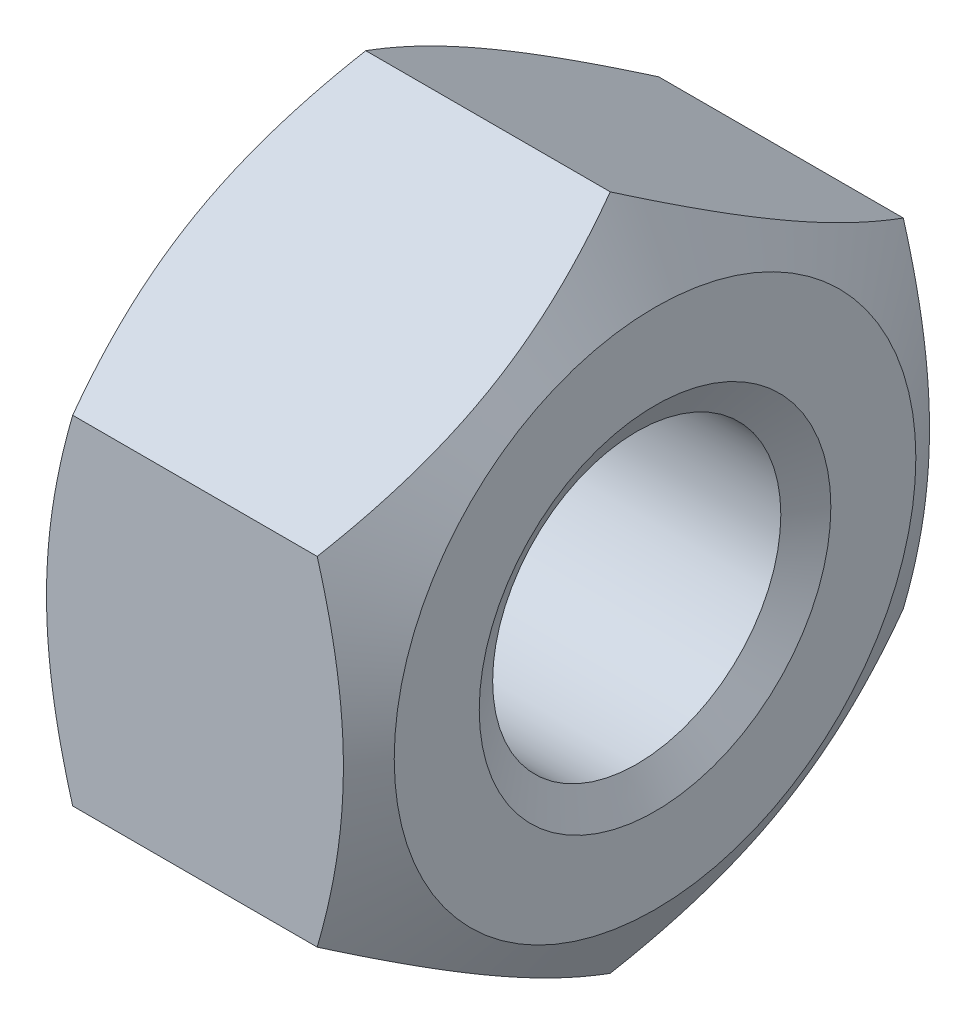
ISO-10303-21;
HEADER;
FILE_DESCRIPTION(('STEP AP214'),'2;1');
FILE_NAME('part.step','',(''),(''),'','','');
FILE_SCHEMA(('AUTOMOTIVE_DESIGN { 1 0 10303 214 1 1 1 1 }'));
ENDSEC;
DATA;
#1=APPLICATION_CONTEXT('core data for automotive mechanical design processes');
#2=APPLICATION_PROTOCOL_DEFINITION('international standard','automotive_design',2000,#1);
#3=PRODUCT_CONTEXT('',#1,'mechanical');
#4=PRODUCT('Part','Part','',(#3));
#5=PRODUCT_RELATED_PRODUCT_CATEGORY('part','',(#4));
#6=PRODUCT_DEFINITION_FORMATION('','',#4);
#7=PRODUCT_DEFINITION_CONTEXT('part definition',#1,'design');
#8=PRODUCT_DEFINITION('design','',#6,#7);
#9=PRODUCT_DEFINITION_SHAPE('','',#8);
#10=(LENGTH_UNIT() NAMED_UNIT(*) SI_UNIT(.MILLI.,.METRE.));
#11=(NAMED_UNIT(*) PLANE_ANGLE_UNIT() SI_UNIT($,.RADIAN.));
#12=(NAMED_UNIT(*) SI_UNIT($,.STERADIAN.) SOLID_ANGLE_UNIT());
#13=UNCERTAINTY_MEASURE_WITH_UNIT(LENGTH_MEASURE(1.E-05),#10,'distance_accuracy_value','');
#14=(GEOMETRIC_REPRESENTATION_CONTEXT(3) GLOBAL_UNCERTAINTY_ASSIGNED_CONTEXT((#13)) GLOBAL_UNIT_ASSIGNED_CONTEXT((#10,
#11,#12)) REPRESENTATION_CONTEXT('',''));
#15=CARTESIAN_POINT('',(0.,0.,0.));
#16=DIRECTION('',(0.,0.,1.));
#17=DIRECTION('',(1.,0.,0.));
#18=AXIS2_PLACEMENT_3D('',#15,#16,#17);
#19=CARTESIAN_POINT('',(0.,-2.88675134594812,-5.00000000000001));
#20=DIRECTION('',(0.,-0.866025403784438,-0.500000000000001));
#21=DIRECTION('',(0.,0.500000000000001,-0.866025403784438));
#22=AXIS2_PLACEMENT_3D('',#19,#20,#21);
#23=PLANE('',#22);
#24=CARTESIAN_POINT('',(4.93587536378223,-5.77350269327806,2.39334483201145E-09));
#25=CARTESIAN_POINT('',(5.00913197597871,-5.64664081463588,-0.219731216958545));
#26=CARTESIAN_POINT('',(5.07576140593012,-5.51869387902661,-0.441341810106548));
#27=CARTESIAN_POINT('',(5.19206166625867,-5.26058465871254,-0.888400093592512));
#28=CARTESIAN_POINT('',(5.2416913601334,-5.13041778931937,-1.11385572484365));
#29=CARTESIAN_POINT('',(5.31893103261935,-4.87167732667603,-1.56200735211579));
#30=CARTESIAN_POINT('',(5.34705553729756,-4.74314402016282,-1.7846335694615));
#31=CARTESIAN_POINT('',(5.37227209133285,-4.54989210804391,-2.11935569991128));
#32=CARTESIAN_POINT('',(5.37785063902691,-4.48543074218098,-2.23100606071116));
#33=CARTESIAN_POINT('',(5.38325622737467,-4.35644850107461,-2.4544098555815));
#34=CARTESIAN_POINT('',(5.38308344577573,-4.2919276277319,-2.5661632863598));
#35=CARTESIAN_POINT('',(5.37469562505833,-4.11517352295994,-2.87231037627117));
#36=CARTESIAN_POINT('',(5.36061837398472,-4.00299890567843,-3.06660251272234));
#37=CARTESIAN_POINT('',(5.31598589248879,-3.77939413491341,-3.45389733650215));
#38=CARTESIAN_POINT('',(5.28541541607219,-3.66796476695895,-3.64689866325456));
#39=CARTESIAN_POINT('',(5.20899966330075,-3.44390976232876,-4.03497331496413));
#40=CARTESIAN_POINT('',(5.16283069779537,-3.33131239240766,-4.2299976804661));
#41=CARTESIAN_POINT('',(5.05804651110353,-3.10779655128824,-4.61713847358142));
#42=CARTESIAN_POINT('',(4.99945589449335,-2.996875218813,-4.80925985707179));
#43=CARTESIAN_POINT('',(4.93587535496804,-2.8867513292997,-5.00000002883592));
#44=B_SPLINE_CURVE_WITH_KNOTS('',3,(#24,#25,#26,#27,#28,#29,#30,#31,#32,#33,#34,#35,#36,#37,#38,
#39,#40,#41,#42,#43),.UNSPECIFIED.,.F.,.F.,(4,2,2,2,2,2,2,2,2,4),(0.,0.792540029113323,
1.58698454301934,2.36176901597434,2.74878733628676,3.13579369563993,3.80946093893152,
4.48375197582745,5.172995557021,5.86088644397328),.UNSPECIFIED.);
#45=CARTESIAN_POINT('',(4.93587537137778,-5.77350268011129,2.044230373443E-08));
#46=VERTEX_POINT('',#45);
#47=CARTESIAN_POINT('',(4.93587535977402,-2.8867513376239,-5.00000001441797));
#48=VERTEX_POINT('',#47);
#49=EDGE_CURVE('E166',#46,#48,#44,.T.);
#50=ORIENTED_EDGE('',*,*,#49,.F.);
#51=DIRECTION('',(1.,0.,0.));
#52=VECTOR('',#51,1.);
#53=CARTESIAN_POINT('',(0.,-5.77350269189626,0.));
#54=LINE('',#53,#52);
#55=CARTESIAN_POINT('',(0.764124628573763,-5.77350268010766,-2.04239832176883E-08));
#56=VERTEX_POINT('',#55);
#57=EDGE_CURVE('E85',#56,#46,#54,.T.);
#58=ORIENTED_EDGE('',*,*,#57,.F.);
#59=CARTESIAN_POINT('',(0.764124644991023,-2.88675132929691,-5.00000002884075));
#60=CARTESIAN_POINT('',(0.690868032080811,-3.01361320817886,-4.78026880907357));
#61=CARTESIAN_POINT('',(0.624238601368808,-3.14156014402914,-4.55865821550813));
#62=CARTESIAN_POINT('',(0.507938339456662,-3.39966936484787,-4.11159993114807));
#63=CARTESIAN_POINT('',(0.45830864475962,-3.52983623450482,-3.88614429944005));
#64=CARTESIAN_POINT('',(0.381068970628507,-3.78857669770394,-3.43799267120525));
#65=CARTESIAN_POINT('',(0.352944465128796,-3.91711000450851,-3.2153664533549));
#66=CARTESIAN_POINT('',(0.327727909906793,-4.11036191709027,-2.88064432210345));
#67=CARTESIAN_POINT('',(0.322149361824922,-4.17482328311138,-2.76899396102957));
#68=CARTESIAN_POINT('',(0.316743772727072,-4.3038055245425,-2.54559016559677));
#69=CARTESIAN_POINT('',(0.316916553963722,-4.36832639805176,-2.43383673453));
#70=CARTESIAN_POINT('',(0.32530437360499,-4.54508050056753,-2.12768964852645));
#71=CARTESIAN_POINT('',(0.339381623574468,-4.65725511543776,-1.93339751625175));
#72=CARTESIAN_POINT('',(0.384014102235427,-4.88085988144037,-1.54610270072068));
#73=CARTESIAN_POINT('',(0.414584576919643,-4.99228924704381,-1.35310137804034));
#74=CARTESIAN_POINT('',(0.491000325714208,-5.21634424692963,-0.965026734548273));
#75=CARTESIAN_POINT('',(0.537169288955863,-5.32894161445994,-0.770002373187272));
#76=CARTESIAN_POINT('',(0.641953470819595,-5.55245745089045,-0.382861588193368));
#77=CARTESIAN_POINT('',(0.700544084867718,-5.66337878106724,-0.19074020868405));
#78=CARTESIAN_POINT('',(0.764124621761453,-5.77350266831268,-4.08479676459328E-08));
#79=B_SPLINE_CURVE_WITH_KNOTS('',3,(#59,#60,#61,#62,#63,#64,#65,#66,#67,#68,#69,#70,#71,#72,#73,
#74,#75,#76,#77,#78),.UNSPECIFIED.,.F.,.F.,(4,2,2,2,2,2,2,2,2,4),(0.,0.792540031091949,
1.58698454701942,2.36176902197982,2.7487873432902,3.13579370363966,3.80946093232886,
4.48375195456929,5.17299552035953,5.86088639203325),.UNSPECIFIED.);
#80=CARTESIAN_POINT('',(0.764124622879802,-2.88675130265502,-5.00000000000001));
#81=VERTEX_POINT('',#80);
#82=EDGE_CURVE('E167',#81,#56,#79,.T.);
#83=ORIENTED_EDGE('',*,*,#82,.F.);
#84=DIRECTION('',(1.,0.,0.));
#85=VECTOR('',#84,1.);
#86=CARTESIAN_POINT('',(0.,-2.88675134594811,-5.00000000000001));
#87=LINE('',#86,#85);
#88=EDGE_CURVE('E228',#48,#81,#87,.F.);
#89=ORIENTED_EDGE('',*,*,#88,.F.);
#90=EDGE_LOOP('',(#50,#58,#83,#89));
#91=FACE_BOUND('',#90,.T.);
#92=ADVANCED_FACE('F17',(#91),#23,.T.);
#93=CARTESIAN_POINT('',(0.,2.88675134594814,-5.));
#94=DIRECTION('',(0.,0.,-1.));
#95=DIRECTION('',(0.,1.,0.));
#96=AXIS2_PLACEMENT_3D('',#93,#94,#95);
#97=PLANE('',#96);
#98=CARTESIAN_POINT('',(4.93587538958568,-2.88675125932593,-5.00000000000001));
#99=CARTESIAN_POINT('',(5.00913199965968,-2.63302750355986,-5.00000000000001));
#100=CARTESIAN_POINT('',(5.0757614273577,-2.37713363386949,-5.00000000000001));
#101=CARTESIAN_POINT('',(5.19206168301077,-1.86091519644852,-5.00000000000001));
#102=CARTESIAN_POINT('',(5.24169137446643,-1.60058145934219,-5.00000000000001));
#103=CARTESIAN_POINT('',(5.31893104217468,-1.08310053732788,-5.00000000000001));
#104=CARTESIAN_POINT('',(5.34705554447796,-0.826033925886894,-5.00000000000001));
#105=CARTESIAN_POINT('',(5.37227209507019,-0.43953010417072,-5.00000000000001));
#106=CARTESIAN_POINT('',(5.37785064163685,-0.310607373303493,-5.00000000000001));
#107=CARTESIAN_POINT('',(5.3832562277966,-0.0526428928575287,-5.00000000000001));
#108=CARTESIAN_POINT('',(5.38308344513708,0.0763988529197466,-5.));
#109=CARTESIAN_POINT('',(5.37469562198609,0.429907045724652,-5.));
#110=CARTESIAN_POINT('',(5.3606183707461,0.654256264429482,-5.));
#111=CARTESIAN_POINT('',(5.31598589130247,1.1014657743961,-5.));
#112=CARTESIAN_POINT('',(5.28541541711002,1.32432449460032,-5.));
#113=CARTESIAN_POINT('',(5.20899967088716,1.77243447201527,-5.));
#114=CARTESIAN_POINT('',(5.16283070978164,1.99762919573092,-5.));
#115=CARTESIAN_POINT('',(5.05804653340742,2.44466084627015,-5.));
#116=CARTESIAN_POINT('',(4.99945592270725,2.66650349564561,-5.));
#117=CARTESIAN_POINT('',(4.93587538958564,2.88675125932608,-5.));
#118=B_SPLINE_CURVE_WITH_KNOTS('',3,(#98,#99,#100,#101,#102,#103,#104,#105,#106,#107,#108,#109,
#110,#111,#112,#113,#114,#115,#116,#117),.UNSPECIFIED.,.F.,.F.,(4,2,2,2,2,2,2,2,2,4),(0.,
0.792540022962358,1.58698453054584,2.36176899799701,2.74878731559224,3.13579367222521,
3.80946086822591,4.48375185765326,5.17299538887457,5.86088622621315),.UNSPECIFIED.);
#119=CARTESIAN_POINT('',(4.93587537708283,2.88675130263711,-5.));
#120=VERTEX_POINT('',#119);
#121=EDGE_CURVE('E142',#48,#120,#118,.T.);
#122=ORIENTED_EDGE('',*,*,#121,.F.);
#123=ORIENTED_EDGE('',*,*,#88,.T.);
#124=CARTESIAN_POINT('',(0.764124645001672,2.88675137928745,-5.));
#125=CARTESIAN_POINT('',(0.690868032094299,2.63302762153567,-5.));
#126=CARTESIAN_POINT('',(0.624238601384378,2.3771337498475,-5.));
#127=CARTESIAN_POINT('',(0.507938339474786,1.86091530823679,-5.));
#128=CARTESIAN_POINT('',(0.458308644778104,1.6005815689373,-5.));
#129=CARTESIAN_POINT('',(0.381068970640841,1.08310064253979,-5.));
#130=CARTESIAN_POINT('',(0.352944465136866,0.826034028916654,-5.));
#131=CARTESIAN_POINT('',(0.327727909910068,0.439530203731249,-5.));
#132=CARTESIAN_POINT('',(0.322149361826874,0.310607471681176,-5.));
#133=CARTESIAN_POINT('',(0.316743772727293,0.052642988803315,-5.));
#134=CARTESIAN_POINT('',(0.316916553963523,-0.0763987582230088,-5.00000000000001));
#135=CARTESIAN_POINT('',(0.325304373524259,-0.429906959936089,-5.00000000000001));
#136=CARTESIAN_POINT('',(0.33938162315328,-0.654256186354715,-5.00000000000001));
#137=CARTESIAN_POINT('',(0.384014100665774,-1.1014657117723,-5.00000000000001));
#138=CARTESIAN_POINT('',(0.414584574540872,-1.32432443971352,-5.00000000000001));
#139=CARTESIAN_POINT('',(0.491000321318403,-1.77243443287805,-5.00000000000001));
#140=CARTESIAN_POINT('',(0.537169283337546,-1.99762916460048,-5.00000000000001));
#141=CARTESIAN_POINT('',(0.641953462490607,-2.44466083090659,-5.00000000000001));
#142=CARTESIAN_POINT('',(0.700544075052189,-2.66650348804301,-5.00000000000001));
#143=CARTESIAN_POINT('',(0.764124610382164,-2.88675125936193,-5.00000000000001));
#144=B_SPLINE_CURVE_WITH_KNOTS('',3,(#124,#125,#126,#127,#128,#129,#130,#131,#132,#133,#134,
#135,#136,#137,#138,#139,#140,#141,#142,#143),.UNSPECIFIED.,.F.,.F.,(4,2,2,2,2,2,2,2,2,4),(0.,
0.792540031054554,1.58698454693958,2.36176902194287,2.748787343277,3.13579370364933,
3.80946092236066,4.48375193458631,5.1729954898417,5.86088635106082),.UNSPECIFIED.);
#145=CARTESIAN_POINT('',(0.76412462288077,2.88675136759301,-4.99999996250998));
#146=VERTEX_POINT('',#145);
#147=EDGE_CURVE('E98',#146,#81,#144,.T.);
#148=ORIENTED_EDGE('',*,*,#147,.F.);
#149=DIRECTION('',(1.,0.,0.));
#150=VECTOR('',#149,1.);
#151=CARTESIAN_POINT('',(0.,2.88675134594814,-4.99999999999999));
#152=LINE('',#151,#150);
#153=EDGE_CURVE('E230',#120,#146,#152,.F.);
#154=ORIENTED_EDGE('',*,*,#153,.F.);
#155=EDGE_LOOP('',(#122,#123,#148,#154));
#156=FACE_BOUND('',#155,.T.);
#157=ADVANCED_FACE('F178',(#156),#97,.T.);
#158=CARTESIAN_POINT('',(0.,5.77350269189626,0.));
#159=DIRECTION('',(0.,0.866025403784439,-0.499999999999999));
#160=DIRECTION('',(0.,0.499999999999999,0.866025403784439));
#161=AXIS2_PLACEMENT_3D('',#158,#159,#160);
#162=PLANE('',#161);
#163=CARTESIAN_POINT('',(4.93587535496808,2.88675132929978,-5.00000002883579));
#164=CARTESIAN_POINT('',(5.00913196787444,3.01361320817531,-4.78026880907972));
#165=CARTESIAN_POINT('',(5.07576139858329,3.14156014401904,-4.55865821552564));
#166=CARTESIAN_POINT('',(5.19206166049065,3.39966936482363,-4.11159993119007));
#167=CARTESIAN_POINT('',(5.24169135518618,3.52983623447298,-3.8861442994952));
#168=CARTESIAN_POINT('',(5.31893102932117,3.78857669767096,-3.4379926712624));
#169=CARTESIAN_POINT('',(5.34705553482401,3.91711000448214,-3.21536645340059));
#170=CARTESIAN_POINT('',(5.37227209004917,4.11036191707424,-2.88064432213121));
#171=CARTESIAN_POINT('',(5.37785063813182,4.17482328309907,-2.76899396105091));
#172=CARTESIAN_POINT('',(5.38325622723036,4.30380552453758,-2.5455901656053));
#173=CARTESIAN_POINT('',(5.38308344599362,4.36832639805052,-2.43383673453216));
#174=CARTESIAN_POINT('',(5.37469562643169,4.54508049890372,-2.12768965140826));
#175=CARTESIAN_POINT('',(5.36061837680246,4.65725511210991,-1.93339752201575));
#176=CARTESIAN_POINT('',(5.31598589929049,4.88085987481248,-1.54610271220052));
#177=CARTESIAN_POINT('',(5.28541542541614,4.99228923877999,-1.35310139235371));
#178=CARTESIAN_POINT('',(5.20899967864094,5.21634423535596,-0.965026754594449));
#179=CARTESIAN_POINT('',(5.16283071662341,5.32894160121399,-0.770002396129926));
#180=CARTESIAN_POINT('',(5.0580465374742,5.55245743436078,-0.382861616823594));
#181=CARTESIAN_POINT('',(4.99945592491485,5.66337876292591,-0.190740240105751));
#182=CARTESIAN_POINT('',(4.93587538958731,5.77350264858234,-7.50219088973408E-08));
#183=B_SPLINE_CURVE_WITH_KNOTS('',3,(#163,#164,#165,#166,#167,#168,#169,#170,#171,#172,#173,
#174,#175,#176,#177,#178,#179,#180,#181,#182),.UNSPECIFIED.,.F.,.F.,(4,2,2,2,2,2,2,2,2,4),(0.,
0.792540031051639,1.58698454693367,2.36176902193432,2.74878734326714,3.13579370363817,
3.80946092233088,4.48375193453785,5.17299548977357,5.86088635097316),.UNSPECIFIED.);
#184=CARTESIAN_POINT('',(4.93587537708366,5.7735026702393,-3.75109543203838E-08));
#185=VERTEX_POINT('',#184);
#186=EDGE_CURVE('E125',#120,#185,#183,.T.);
#187=ORIENTED_EDGE('',*,*,#186,.F.);
#188=ORIENTED_EDGE('',*,*,#153,.T.);
#189=CARTESIAN_POINT('',(0.764124644995819,5.77350270855578,2.88551346379425E-08));
#190=CARTESIAN_POINT('',(0.690868032088923,5.64664082968005,-0.219731190901268));
#191=CARTESIAN_POINT('',(0.624238601379511,5.51869389383614,-0.441341784455687));
#192=CARTESIAN_POINT('',(0.507938339470976,5.26058467303114,-0.888400068791962));
#193=CARTESIAN_POINT('',(0.458308644774841,5.13041780338158,-1.1138557004872));
#194=CARTESIAN_POINT('',(0.381068970638665,4.87167734018319,-1.56200732872071));
#195=CARTESIAN_POINT('',(0.352944465135232,4.74314403337181,-1.78463354658286));
#196=CARTESIAN_POINT('',(0.327727909909218,4.5498921207794,-2.11935567785277));
#197=CARTESIAN_POINT('',(0.322149361826281,4.48543075475447,-2.23100603893326));
#198=CARTESIAN_POINT('',(0.316743772727197,4.35644851331574,-2.45440983437924));
#199=CARTESIAN_POINT('',(0.316916553963667,4.29192763980269,-2.56616326545258));
#200=CARTESIAN_POINT('',(0.325304373525023,4.11517353894664,-2.87231034858141));
#201=CARTESIAN_POINT('',(0.33938162315437,4.00299892573771,-3.06660247797865));
#202=CARTESIAN_POINT('',(0.384014100667372,3.7793941630297,-3.45389728780331));
#203=CARTESIAN_POINT('',(0.414584574542651,3.66796479905949,-3.64689860765481));
#204=CARTESIAN_POINT('',(0.491000321320408,3.44390980247803,-4.03497324542356));
#205=CARTESIAN_POINT('',(0.53716928333959,3.33131243661723,-4.22999760389289));
#206=CARTESIAN_POINT('',(0.64195346249261,3.10779660346499,-4.61713838320866));
#207=CARTESIAN_POINT('',(0.700544075054112,2.99687527489718,-4.80925975993115));
#208=CARTESIAN_POINT('',(0.764124610383961,2.88675138923811,-4.99999992501956));
#209=B_SPLINE_CURVE_WITH_KNOTS('',3,(#189,#190,#191,#192,#193,#194,#195,#196,#197,#198,#199,
#200,#201,#202,#203,#204,#205,#206,#207,#208),.UNSPECIFIED.,.F.,.F.,(4,2,2,2,2,2,2,2,2,4),(0.,
0.792540031053193,1.58698454693682,2.36176902193883,2.74878734327232,3.13579370364402,
3.80946092235309,4.48375193457647,5.17299548982947,5.86088635104621),.UNSPECIFIED.);
#210=CARTESIAN_POINT('',(0.764124622877404,5.77350267024556,3.75001129650675E-08));
#211=VERTEX_POINT('',#210);
#212=EDGE_CURVE('E97',#211,#146,#209,.T.);
#213=ORIENTED_EDGE('',*,*,#212,.F.);
#214=DIRECTION('',(1.,0.,0.));
#215=VECTOR('',#214,1.);
#216=CARTESIAN_POINT('',(0.,5.77350269189626,0.));
#217=LINE('',#216,#215);
#218=EDGE_CURVE('E86',#185,#211,#217,.F.);
#219=ORIENTED_EDGE('',*,*,#218,.F.);
#220=EDGE_LOOP('',(#187,#188,#213,#219));
#221=FACE_BOUND('',#220,.T.);
#222=ADVANCED_FACE('F114',(#221),#162,.T.);
#223=CARTESIAN_POINT('',(0.,2.88675134594813,5.));
#224=DIRECTION('',(0.,0.866025403784438,0.5));
#225=DIRECTION('',(0.,-0.5,0.866025403784438));
#226=AXIS2_PLACEMENT_3D('',#223,#224,#225);
#227=PLANE('',#226);
#228=CARTESIAN_POINT('',(4.93587535496641,5.7735027085475,-2.88408007331611E-08));
#229=CARTESIAN_POINT('',(5.00913196787291,5.64664082967192,0.219731190915362));
#230=CARTESIAN_POINT('',(5.07576139858191,5.51869389382814,0.44134178446954));
#231=CARTESIAN_POINT('',(5.19206166048958,5.26058467302343,0.888400068805309));
#232=CARTESIAN_POINT('',(5.24169135518527,5.13041780337402,1.11385570050028));
#233=CARTESIAN_POINT('',(5.31893102932056,4.87167734017594,1.56200732873327));
#234=CARTESIAN_POINT('',(5.34705553482355,4.74314403336471,1.78463354659516));
#235=CARTESIAN_POINT('',(5.37227209004892,4.54989212077254,2.11935567786466));
#236=CARTESIAN_POINT('',(5.37785063813165,4.48543075474768,2.231006038945));
#237=CARTESIAN_POINT('',(5.38325622723033,4.35644851330912,2.4544098343907));
#238=CARTESIAN_POINT('',(5.38308344599367,4.29192763979615,2.56616326546389));
#239=CARTESIAN_POINT('',(5.37469562643183,4.11517353894107,2.87231034859106));
#240=CARTESIAN_POINT('',(5.36061837680233,4.00299892573302,3.06660247798677));
#241=CARTESIAN_POINT('',(5.31598589928931,3.77939416302677,3.45389728780839));
#242=CARTESIAN_POINT('',(5.28541542541415,3.66796479905743,3.64689860765836));
#243=CARTESIAN_POINT('',(5.2089996786369,3.44390980247775,4.03497324542404));
#244=CARTESIAN_POINT('',(5.1628307166181,3.33131243661786,4.2299976038918));
#245=CARTESIAN_POINT('',(5.05804653746603,3.10779660346739,4.6171383832045));
#246=CARTESIAN_POINT('',(4.9994559249051,2.99687527490046,4.80925975992547));
#247=CARTESIAN_POINT('',(4.93587538957588,2.88675138924225,4.99999992501239));
#248=B_SPLINE_CURVE_WITH_KNOTS('',3,(#228,#229,#230,#231,#232,#233,#234,#235,#236,#237,#238,
#239,#240,#241,#242,#243,#244,#245,#246,#247),.UNSPECIFIED.,.F.,.F.,(4,2,2,2,2,2,2,2,2,4),(0.,
0.792540031052068,1.58698454693454,2.36176902193552,2.7487873432685,3.13579370363969,
3.80946092234352,4.48375193456166,5.17299548980913,5.86088635102038),.UNSPECIFIED.);
#249=CARTESIAN_POINT('',(4.93587537707794,2.88675136759519,4.99999996250619));
#250=VERTEX_POINT('',#249);
#251=EDGE_CURVE('E119',#185,#250,#248,.T.);
#252=ORIENTED_EDGE('',*,*,#251,.F.);
#253=ORIENTED_EDGE('',*,*,#218,.T.);
#254=CARTESIAN_POINT('',(0.764124644990542,2.88675132929775,5.00000002883931));
#255=CARTESIAN_POINT('',(0.69086803208408,3.01361320817332,4.78026880908317));
#256=CARTESIAN_POINT('',(0.624238601375129,3.14156014401708,4.55865821552902));
#257=CARTESIAN_POINT('',(0.507938339467549,3.39966936482175,4.11159993119332));
#258=CARTESIAN_POINT('',(0.458308644771909,3.52983623447114,3.88614429949838));
#259=CARTESIAN_POINT('',(0.38106897063671,3.78857669766919,3.43799267126545));
#260=CARTESIAN_POINT('',(0.352944465133763,3.91711000448041,3.21536645340357));
#261=CARTESIAN_POINT('',(0.327727909908453,4.11036191707256,2.88064432213411));
#262=CARTESIAN_POINT('',(0.322149361825746,4.17482328309741,2.76899396105378));
#263=CARTESIAN_POINT('',(0.31674377272711,4.30380552453595,2.54559016560811));
#264=CARTESIAN_POINT('',(0.316916553963796,4.36832639804892,2.43383673453493));
#265=CARTESIAN_POINT('',(0.325304373525653,4.54508049890333,2.12768965140894));
#266=CARTESIAN_POINT('',(0.339381623155048,4.6572551121107,1.93339752201438));
#267=CARTESIAN_POINT('',(0.38401410066768,4.88085987481562,1.54610271219507));
#268=CARTESIAN_POINT('',(0.414584574542539,4.9922892387843,1.35310139234624));
#269=CARTESIAN_POINT('',(0.491000321319043,5.21634423536265,0.965026754582877));
#270=CARTESIAN_POINT('',(0.537169283337377,5.32894160122187,0.770002396116281));
#271=CARTESIAN_POINT('',(0.641953462488402,5.55245743437101,0.382861616805879));
#272=CARTESIAN_POINT('',(0.70054407504876,5.66337876293729,0.190740240086038));
#273=CARTESIAN_POINT('',(0.764124610377367,5.77350264859486,7.50002252077645E-08));
#274=B_SPLINE_CURVE_WITH_KNOTS('',3,(#254,#255,#256,#257,#258,#259,#260,#261,#262,#263,#264,
#265,#266,#267,#268,#269,#270,#271,#272,#273),.UNSPECIFIED.,.F.,.F.,(4,2,2,2,2,2,2,2,2,4),(0.,
0.792540031051937,1.58698454693427,2.36176902193516,2.74878734326809,3.13579370363923,
3.80946092233905,4.48375193455316,5.17299548979639,5.86088635100343),.UNSPECIFIED.);
#275=CARTESIAN_POINT('',(0.764124622880041,2.88675130265587,5.));
#276=VERTEX_POINT('',#275);
#277=EDGE_CURVE('E92',#276,#211,#274,.T.);
#278=ORIENTED_EDGE('',*,*,#277,.F.);
#279=DIRECTION('',(1.,0.,0.));
#280=VECTOR('',#279,1.);
#281=CARTESIAN_POINT('',(0.,2.88675134594813,5.));
#282=LINE('',#281,#280);
#283=EDGE_CURVE('E79',#250,#276,#282,.F.);
#284=ORIENTED_EDGE('',*,*,#283,.F.);
#285=EDGE_LOOP('',(#252,#253,#278,#284));
#286=FACE_BOUND('',#285,.T.);
#287=ADVANCED_FACE('F95',(#286),#227,.T.);
#288=CARTESIAN_POINT('',(0.,-2.88675134594813,5.));
#289=DIRECTION('',(0.,0.,1.));
#290=DIRECTION('',(1.,0.,0.));
#291=AXIS2_PLACEMENT_3D('',#288,#289,#290);
#292=PLANE('',#291);
#293=CARTESIAN_POINT('',(4.93587535496526,2.88675137925461,5.));
#294=CARTESIAN_POINT('',(5.00913196787185,2.63302762150338,5.));
#295=CARTESIAN_POINT('',(5.07576139858095,2.37713374981575,5.));
#296=CARTESIAN_POINT('',(5.19206166048883,1.8609153082062,5.));
#297=CARTESIAN_POINT('',(5.24169135518463,1.60058156890731,5.));
#298=CARTESIAN_POINT('',(5.31893102932013,1.08310064251099,5.));
#299=CARTESIAN_POINT('',(5.34705553482323,0.826034028888453,5.));
#300=CARTESIAN_POINT('',(5.37227209004876,0.439530203703998,5.));
#301=CARTESIAN_POINT('',(5.37785063813154,0.310607471654249,5.));
#302=CARTESIAN_POINT('',(5.38325622723031,0.0526429887770531,5.));
#303=CARTESIAN_POINT('',(5.3830834459937,-0.0763987582489289,5.));
#304=CARTESIAN_POINT('',(5.37469562643198,-0.429906959959555,5.));
#305=CARTESIAN_POINT('',(5.36061837680252,-0.654256186376053,5.));
#306=CARTESIAN_POINT('',(5.3159858992895,-1.10146571178938,5.));
#307=CARTESIAN_POINT('',(5.28541542541432,-1.32432443972847,5.));
#308=CARTESIAN_POINT('',(5.20899967863695,-1.77243443288865,5.));
#309=CARTESIAN_POINT('',(5.16283071661806,-1.99762916460887,5.));
#310=CARTESIAN_POINT('',(5.05804653746578,-2.44466083091064,5.));
#311=CARTESIAN_POINT('',(4.99945592490471,-2.66650348804491,5.));
#312=CARTESIAN_POINT('',(4.93587538957535,-2.88675125936173,5.));
#313=B_SPLINE_CURVE_WITH_KNOTS('',3,(#293,#294,#295,#296,#297,#298,#299,#300,#301,#302,#303,
#304,#305,#306,#307,#308,#309,#310,#311,#312),.UNSPECIFIED.,.F.,.F.,(4,2,2,2,2,2,2,2,2,4),(0.,
0.79254003105234,1.58698454693509,2.36176902193632,2.74878734326942,3.13579370364073,
3.80946092234579,4.48375193456515,5.17299548981392,5.86088635102645),.UNSPECIFIED.);
#314=CARTESIAN_POINT('',(4.93587537707768,-2.88675130265493,5.));
#315=VERTEX_POINT('',#314);
#316=EDGE_CURVE('E41',#250,#315,#313,.T.);
#317=ORIENTED_EDGE('',*,*,#316,.F.);
#318=ORIENTED_EDGE('',*,*,#283,.T.);
#319=CARTESIAN_POINT('',(0.764124610375649,-2.88675125933938,5.));
#320=CARTESIAN_POINT('',(0.690868000301332,-2.63302750357308,5.));
#321=CARTESIAN_POINT('',(0.624238572602963,-2.37713363388248,5.));
#322=CARTESIAN_POINT('',(0.507938316949188,-1.86091519646101,5.));
#323=CARTESIAN_POINT('',(0.458308625493172,-1.60058145935442,5.));
#324=CARTESIAN_POINT('',(0.381068957784199,-1.08310053733962,5.));
#325=CARTESIAN_POINT('',(0.352944455480567,-0.826033925898401,5.));
#326=CARTESIAN_POINT('',(0.327727904887815,-0.439530104181858,5.));
#327=CARTESIAN_POINT('',(0.32214935832099,-0.310607373314506,5.));
#328=CARTESIAN_POINT('',(0.31674377216091,-0.052642892868283,5.));
#329=CARTESIAN_POINT('',(0.316916554820266,0.0763988529091251,5.));
#330=CARTESIAN_POINT('',(0.32530437797093,0.429907045718192,5.));
#331=CARTESIAN_POINT('',(0.339381629211065,0.654256264427052,5.));
#332=CARTESIAN_POINT('',(0.384014108655576,1.10146577440168,5.));
#333=CARTESIAN_POINT('',(0.414584582848753,1.32432449460987,5.));
#334=CARTESIAN_POINT('',(0.491000329073598,1.77243447203289,5.));
#335=CARTESIAN_POINT('',(0.537169290180388,1.99762919575262,5.));
#336=CARTESIAN_POINT('',(0.641953466557499,2.44466084629987,5.));
#337=CARTESIAN_POINT('',(0.700544077259302,2.66650349567926,5.));
#338=CARTESIAN_POINT('',(0.764124610382642,2.88675125936361,5.));
#339=B_SPLINE_CURVE_WITH_KNOTS('',3,(#319,#320,#321,#322,#323,#324,#325,#326,#327,#328,#329,
#330,#331,#332,#333,#334,#335,#336,#337,#338),.UNSPECIFIED.,.F.,.F.,(4,2,2,2,2,2,2,2,2,4),(0.,
0.792540022963302,1.58698453054776,2.36176899799974,2.74878731559536,3.13579367222873,
3.80946086824149,4.48375185768094,5.17299538891498,5.8608862262662),.UNSPECIFIED.);
#340=CARTESIAN_POINT('',(0.764124640187489,-2.88675133761688,5.00000001443014));
#341=VERTEX_POINT('',#340);
#342=EDGE_CURVE('E21',#341,#276,#339,.T.);
#343=ORIENTED_EDGE('',*,*,#342,.F.);
#344=DIRECTION('',(1.,0.,0.));
#345=VECTOR('',#344,1.);
#346=CARTESIAN_POINT('',(0.,-2.88675134594813,5.));
#347=LINE('',#346,#345);
#348=EDGE_CURVE('E73',#315,#341,#347,.F.);
#349=ORIENTED_EDGE('',*,*,#348,.F.);
#350=EDGE_LOOP('',(#317,#318,#343,#349));
#351=FACE_BOUND('',#350,.T.);
#352=ADVANCED_FACE('F81',(#351),#292,.T.);
#353=CARTESIAN_POINT('',(0.,-5.77350269189626,0.));
#354=DIRECTION('',(0.,-0.866025403784439,0.5));
#355=DIRECTION('',(0.,-0.5,-0.866025403784439));
#356=AXIS2_PLACEMENT_3D('',#353,#354,#355);
#357=PLANE('',#356);
#358=CARTESIAN_POINT('',(4.93587535496579,-2.88675132929581,5.00000002884267));
#359=CARTESIAN_POINT('',(5.00913196787605,-3.01361320817777,4.78026880907547));
#360=CARTESIAN_POINT('',(5.0757613985881,-3.14156014402806,4.55865821551001));
#361=CARTESIAN_POINT('',(5.19206166050036,-3.39966936484682,4.1115999311499));
#362=CARTESIAN_POINT('',(5.24169135519746,-3.52983623450377,3.88614429944186));
#363=CARTESIAN_POINT('',(5.3189310293287,-3.78857669770294,3.437992671207));
#364=CARTESIAN_POINT('',(5.34705553482847,-3.91711000450754,3.2153664533566));
#365=CARTESIAN_POINT('',(5.37227209005056,-4.11036191708933,2.88064432210507));
#366=CARTESIAN_POINT('',(5.37785063813246,-4.17482328311047,2.76899396103117));
#367=CARTESIAN_POINT('',(5.38325622723037,-4.30380552454161,2.54559016559831));
#368=CARTESIAN_POINT('',(5.38308344599374,-4.36832639805089,2.43383673453152));
#369=CARTESIAN_POINT('',(5.37469562635263,-4.54508050056496,2.12768964853092));
#370=CARTESIAN_POINT('',(5.36061837638354,-4.65725511543347,1.93339751625918));
#371=CARTESIAN_POINT('',(5.31598589772385,-4.88085988143268,1.54610270073399));
#372=CARTESIAN_POINT('',(5.28541542304051,-4.99228924703445,1.35310137805657));
#373=CARTESIAN_POINT('',(5.2089996742481,-5.21634424691686,0.965026734570394));
#374=CARTESIAN_POINT('',(5.16283071100774,-5.32894161444545,0.77000237321237));
#375=CARTESIAN_POINT('',(5.05804652914687,-5.55245745087259,0.382861588224312));
#376=CARTESIAN_POINT('',(4.99945591510031,-5.66337878104772,0.190740208717862));
#377=CARTESIAN_POINT('',(4.93587537820821,-5.77350266829152,4.08846080267804E-08));
#378=B_SPLINE_CURVE_WITH_KNOTS('',3,(#358,#359,#360,#361,#362,#363,#364,#365,#366,#367,#368,
#369,#370,#371,#372,#373,#374,#375,#376,#377),.UNSPECIFIED.,.F.,.F.,(4,2,2,2,2,2,2,2,2,4),(0.,
0.792540031092055,1.58698454701964,2.36176902198022,2.74878734329068,3.13579370364024,
3.80946093231914,4.48375195454924,5.1729955203286,5.86088639199154),.UNSPECIFIED.);
#379=EDGE_CURVE('E149',#315,#46,#378,.T.);
#380=ORIENTED_EDGE('',*,*,#379,.F.);
#381=ORIENTED_EDGE('',*,*,#348,.T.);
#382=CARTESIAN_POINT('',(0.764124636186869,-5.77350269329823,-2.42828345392731E-09));
#383=CARTESIAN_POINT('',(0.690868023989426,-5.64664081465571,0.219731216924193));
#384=CARTESIAN_POINT('',(0.624238594037009,-5.5186938790461,0.441341810072786));
#385=CARTESIAN_POINT('',(0.507938333706349,-5.26058465873131,0.888400093559988));
#386=CARTESIAN_POINT('',(0.458308639830525,-5.13041778933778,1.11385572481178));
#387=CARTESIAN_POINT('',(0.381068967342418,-4.8716773266937,1.56200735208519));
#388=CARTESIAN_POINT('',(0.352944462663137,-4.74314402018012,1.78463356943153));
#389=CARTESIAN_POINT('',(0.327727908626287,-4.54989210806064,2.11935569988231));
#390=CARTESIAN_POINT('',(0.322149360931723,-4.48543074219752,2.23100606068253));
#391=CARTESIAN_POINT('',(0.316743772582971,-4.35644850109074,2.45440985555357));
#392=CARTESIAN_POINT('',(0.316916554181437,-4.29192762774782,2.56616328633222));
#393=CARTESIAN_POINT('',(0.325304374897683,-4.11517352297318,2.87231037624824));
#394=CARTESIAN_POINT('',(0.339381625970991,-4.00299890568919,3.06660251270371));
#395=CARTESIAN_POINT('',(0.384014107467091,-3.77939413491922,3.45389733649209));
#396=CARTESIAN_POINT('',(0.414584583884163,-3.66796476696229,3.64689866324878));
#397=CARTESIAN_POINT('',(0.491000336657233,-3.4439097623271,4.03497331496702));
#398=CARTESIAN_POINT('',(0.537169302163794,-3.33131239240346,4.22999768047338));
#399=CARTESIAN_POINT('',(0.641953488858501,-3.10779655127905,4.61713847359735));
#400=CARTESIAN_POINT('',(0.700544105470363,-2.99687521880135,4.80925985709197));
#401=CARTESIAN_POINT('',(0.764124644997536,-2.88675132928564,5.00000002886029));
#402=B_SPLINE_CURVE_WITH_KNOTS('',3,(#382,#383,#384,#385,#386,#387,#388,#389,#390,#391,#392,
#393,#394,#395,#396,#397,#398,#399,#400,#401),.UNSPECIFIED.,.F.,.F.,(4,2,2,2,2,2,2,2,2,4),(0.,
0.792540029116073,1.58698454302491,2.36176901598242,2.74878733629608,3.1357936956505,
3.80946093895685,4.48375197586759,5.17299555707675,5.86088644404452),.UNSPECIFIED.);
#403=EDGE_CURVE('E94',#56,#341,#402,.T.);
#404=ORIENTED_EDGE('',*,*,#403,.F.);
#405=ORIENTED_EDGE('',*,*,#57,.T.);
#406=EDGE_LOOP('',(#380,#381,#404,#405));
#407=FACE_BOUND('',#406,.T.);
#408=ADVANCED_FACE('F157',(#407),#357,.T.);
#409=CARTESIAN_POINT('',(0.768709383180521,0.,0.));
#410=DIRECTION('',(1.,0.,0.));
#411=DIRECTION('',(0.,0.,-1.));
#412=AXIS2_PLACEMENT_3D('',#409,#410,#411);
#413=CONICAL_SURFACE('',#412,5.78144370803102,1.04719755119307);
#414=CARTESIAN_POINT('',(-5.68433104405908E-11,0.,0.));
#415=DIRECTION('',(1.,0.,0.));
#416=DIRECTION('',(0.,0.,-1.));
#417=AXIS2_PLACEMENT_3D('',#414,#415,#416);
#418=CIRCLE('',#417,4.45000000001983);
#419=CARTESIAN_POINT('',(-5.68433104405908E-11,0.,-4.45000000001983));
#420=VERTEX_POINT('',#419);
#421=EDGE_CURVE('E155',#420,#420,#418,.T.);
#422=ORIENTED_EDGE('',*,*,#421,.T.);
#423=EDGE_LOOP('',(#422));
#424=FACE_BOUND('',#423,.T.);
#425=ORIENTED_EDGE('',*,*,#82,.T.);
#426=ORIENTED_EDGE('',*,*,#403,.T.);
#427=ORIENTED_EDGE('',*,*,#342,.T.);
#428=ORIENTED_EDGE('',*,*,#277,.T.);
#429=ORIENTED_EDGE('',*,*,#212,.T.);
#430=ORIENTED_EDGE('',*,*,#147,.T.);
#431=EDGE_LOOP('',(#425,#426,#427,#428,#429,#430));
#432=FACE_BOUND('',#431,.T.);
#433=ADVANCED_FACE('F90',(#424,#432),#413,.T.);
#434=CARTESIAN_POINT('',(4.93129061680975,0.,0.));
#435=DIRECTION('',(-1.,0.,0.));
#436=DIRECTION('',(0.,0.,1.));
#437=AXIS2_PLACEMENT_3D('',#434,#435,#436);
#438=CONICAL_SURFACE('',#437,5.78144370797418,1.04719755119307);
#439=ORIENTED_EDGE('',*,*,#379,.T.);
#440=ORIENTED_EDGE('',*,*,#49,.T.);
#441=ORIENTED_EDGE('',*,*,#121,.T.);
#442=ORIENTED_EDGE('',*,*,#186,.T.);
#443=ORIENTED_EDGE('',*,*,#251,.T.);
#444=ORIENTED_EDGE('',*,*,#316,.T.);
#445=EDGE_LOOP('',(#439,#440,#441,#442,#443,#444));
#446=FACE_BOUND('',#445,.T.);
#447=CARTESIAN_POINT('',(5.70000000004711,0.,0.));
#448=DIRECTION('',(-1.,0.,0.));
#449=DIRECTION('',(0.,0.,1.));
#450=AXIS2_PLACEMENT_3D('',#447,#448,#449);
#451=CIRCLE('',#450,4.44999999996298);
#452=CARTESIAN_POINT('',(5.70000000004711,0.,4.44999999996298));
#453=VERTEX_POINT('',#452);
#454=EDGE_CURVE('E220',#453,#453,#451,.F.);
#455=ORIENTED_EDGE('',*,*,#454,.F.);
#456=EDGE_LOOP('',(#455));
#457=FACE_BOUND('',#456,.T.);
#458=ADVANCED_FACE('F134',(#446,#457),#438,.T.);
#459=CARTESIAN_POINT('',(0.,0.,0.));
#460=DIRECTION('',(1.,0.,0.));
#461=DIRECTION('',(0.,0.,-1.));
#462=AXIS2_PLACEMENT_3D('',#459,#460,#461);
#463=PLANE('',#462);
#464=CARTESIAN_POINT('',(-1.75874150064672E-11,0.,0.));
#465=DIRECTION('',(-1.,0.,0.));
#466=DIRECTION('',(0.,0.,1.));
#467=AXIS2_PLACEMENT_3D('',#464,#465,#466);
#468=CIRCLE('',#467,2.99976587734818);
#469=CARTESIAN_POINT('',(-1.75874150064672E-11,0.,2.99976587734818));
#470=VERTEX_POINT('',#469);
#471=EDGE_CURVE('E222',#470,#470,#468,.F.);
#472=ORIENTED_EDGE('',*,*,#471,.T.);
#473=EDGE_LOOP('',(#472));
#474=FACE_BOUND('',#473,.T.);
#475=ORIENTED_EDGE('',*,*,#421,.F.);
#476=EDGE_LOOP('',(#475));
#477=FACE_BOUND('',#476,.T.);
#478=ADVANCED_FACE('F138',(#474,#477),#463,.F.);
#479=CARTESIAN_POINT('',(5.7,0.,0.));
#480=DIRECTION('',(1.,0.,0.));
#481=DIRECTION('',(0.,0.,-1.));
#482=AXIS2_PLACEMENT_3D('',#479,#480,#481);
#483=PLANE('',#482);
#484=CARTESIAN_POINT('',(5.70000000000786,0.,0.));
#485=DIRECTION('',(1.,0.,0.));
#486=DIRECTION('',(0.,0.,-1.));
#487=AXIS2_PLACEMENT_3D('',#484,#485,#486);
#488=CIRCLE('',#487,2.99976587734818);
#489=CARTESIAN_POINT('',(5.70000000000786,0.,-2.99976587734818));
#490=VERTEX_POINT('',#489);
#491=EDGE_CURVE('E217',#490,#490,#488,.F.);
#492=ORIENTED_EDGE('',*,*,#491,.T.);
#493=EDGE_LOOP('',(#492));
#494=FACE_BOUND('',#493,.T.);
#495=ORIENTED_EDGE('',*,*,#454,.T.);
#496=EDGE_LOOP('',(#495));
#497=FACE_BOUND('',#496,.T.);
#498=ADVANCED_FACE('F206',(#494,#497),#483,.T.);
#499=CARTESIAN_POINT('',(1.13686837721616E-10,0.,0.));
#500=DIRECTION('',(-1.,0.,0.));
#501=DIRECTION('',(0.,0.,1.));
#502=AXIS2_PLACEMENT_3D('',#499,#500,#501);
#503=CONICAL_SURFACE('',#502,2.99976587712081,1.04719755118242);
#504=CARTESIAN_POINT('',(0.3125,0.,0.));
#505=DIRECTION('',(1.,0.,0.));
#506=DIRECTION('',(0.,0.,-1.));
#507=AXIS2_PLACEMENT_3D('',#504,#505,#506);
#508=CIRCLE('',#507,2.4585);
#509=CARTESIAN_POINT('',(0.3125,0.,-2.4585));
#510=VERTEX_POINT('',#509);
#511=EDGE_CURVE('E32',#510,#510,#508,.T.);
#512=ORIENTED_EDGE('',*,*,#511,.T.);
#513=EDGE_LOOP('',(#512));
#514=FACE_BOUND('',#513,.T.);
#515=ORIENTED_EDGE('',*,*,#471,.F.);
#516=EDGE_LOOP('',(#515));
#517=FACE_BOUND('',#516,.T.);
#518=ADVANCED_FACE('F199',(#514,#517),#503,.F.);
#519=CARTESIAN_POINT('',(5.69999999987658,0.,0.));
#520=DIRECTION('',(1.,0.,0.));
#521=DIRECTION('',(0.,0.,-1.));
#522=AXIS2_PLACEMENT_3D('',#519,#520,#521);
#523=CONICAL_SURFACE('',#522,2.99976587712081,1.04719755118242);
#524=CARTESIAN_POINT('',(5.3875,0.,0.));
#525=DIRECTION('',(1.,0.,0.));
#526=DIRECTION('',(0.,0.,-1.));
#527=AXIS2_PLACEMENT_3D('',#524,#525,#526);
#528=CIRCLE('',#527,2.4585);
#529=CARTESIAN_POINT('',(5.3875,0.,-2.4585));
#530=VERTEX_POINT('',#529);
#531=EDGE_CURVE('E11',#530,#530,#528,.F.);
#532=ORIENTED_EDGE('',*,*,#531,.T.);
#533=EDGE_LOOP('',(#532));
#534=FACE_BOUND('',#533,.T.);
#535=ORIENTED_EDGE('',*,*,#491,.F.);
#536=EDGE_LOOP('',(#535));
#537=FACE_BOUND('',#536,.T.);
#538=ADVANCED_FACE('F193',(#534,#537),#523,.F.);
#539=CARTESIAN_POINT('',(-10.6529951697165,0.,0.));
#540=DIRECTION('',(1.,0.,0.));
#541=DIRECTION('',(0.,0.,-1.));
#542=AXIS2_PLACEMENT_3D('',#539,#540,#541);
#543=CYLINDRICAL_SURFACE('',#542,2.4585);
#544=ORIENTED_EDGE('',*,*,#511,.F.);
#545=EDGE_LOOP('',(#544));
#546=FACE_BOUND('',#545,.T.);
#547=ORIENTED_EDGE('',*,*,#531,.F.);
#548=EDGE_LOOP('',(#547));
#549=FACE_BOUND('',#548,.T.);
#550=ADVANCED_FACE('F191',(#546,#549),#543,.F.);
#551=CLOSED_SHELL('',(#92,#157,#222,#287,#352,#408,#433,#458,#478,#498,#518,#538,#550));
#552=MANIFOLD_SOLID_BREP('B1',#551);
#553=ADVANCED_BREP_SHAPE_REPRESENTATION('',(#18,#552),#14);
#554=SHAPE_DEFINITION_REPRESENTATION(#9,#553);
ENDSEC;
END-ISO-10303-21;
